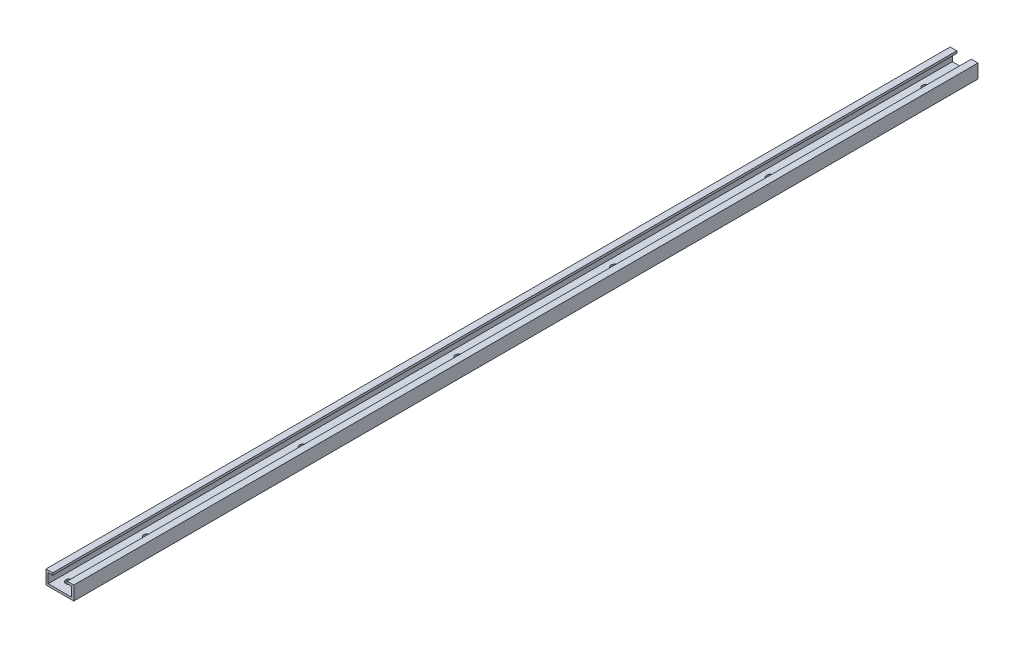
ISO-10303-21;
HEADER;
FILE_DESCRIPTION(('STEP AP214'),'2;1');
FILE_NAME('part.step','',(''),(''),'','','');
FILE_SCHEMA(('AUTOMOTIVE_DESIGN { 1 0 10303 214 1 1 1 1 }'));
ENDSEC;
DATA;
#1=APPLICATION_CONTEXT('core data for automotive mechanical design processes');
#2=APPLICATION_PROTOCOL_DEFINITION('international standard','automotive_design',2000,#1);
#3=PRODUCT_CONTEXT('',#1,'mechanical');
#4=PRODUCT('Part','Part','',(#3));
#5=PRODUCT_RELATED_PRODUCT_CATEGORY('part','',(#4));
#6=PRODUCT_DEFINITION_FORMATION('','',#4);
#7=PRODUCT_DEFINITION_CONTEXT('part definition',#1,'design');
#8=PRODUCT_DEFINITION('design','',#6,#7);
#9=PRODUCT_DEFINITION_SHAPE('','',#8);
#10=(LENGTH_UNIT() NAMED_UNIT(*) SI_UNIT(.MILLI.,.METRE.));
#11=(NAMED_UNIT(*) PLANE_ANGLE_UNIT() SI_UNIT($,.RADIAN.));
#12=(NAMED_UNIT(*) SI_UNIT($,.STERADIAN.) SOLID_ANGLE_UNIT());
#13=UNCERTAINTY_MEASURE_WITH_UNIT(LENGTH_MEASURE(1.E-05),#10,'distance_accuracy_value','');
#14=(GEOMETRIC_REPRESENTATION_CONTEXT(3) GLOBAL_UNCERTAINTY_ASSIGNED_CONTEXT((#13)) GLOBAL_UNIT_ASSIGNED_CONTEXT((#10,
#11,#12)) REPRESENTATION_CONTEXT('',''));
#15=CARTESIAN_POINT('',(0.,0.,0.));
#16=DIRECTION('',(0.,0.,1.));
#17=DIRECTION('',(1.,0.,0.));
#18=AXIS2_PLACEMENT_3D('',#15,#16,#17);
#19=CARTESIAN_POINT('',(-6.5,12.5,813.));
#20=DIRECTION('',(-1.,0.,0.));
#21=DIRECTION('',(0.,0.,1.));
#22=AXIS2_PLACEMENT_3D('',#19,#20,#21);
#23=PLANE('',#22);
#24=DIRECTION('',(0.,1.,0.));
#25=VECTOR('',#24,1.);
#26=CARTESIAN_POINT('',(-6.5,12.5,0.));
#27=LINE('',#26,#25);
#28=CARTESIAN_POINT('',(-6.5,10.5,0.));
#29=VERTEX_POINT('',#28);
#30=CARTESIAN_POINT('',(-6.5,12.5,0.));
#31=VERTEX_POINT('',#30);
#32=EDGE_CURVE('E157',#29,#31,#27,.T.);
#33=ORIENTED_EDGE('',*,*,#32,.T.);
#34=DIRECTION('',(0.,0.,-1.));
#35=VECTOR('',#34,1.);
#36=CARTESIAN_POINT('',(-6.5,12.5,813.));
#37=LINE('',#36,#35);
#38=CARTESIAN_POINT('',(-6.5,12.5,813.));
#39=VERTEX_POINT('',#38);
#40=EDGE_CURVE('E205',#39,#31,#37,.T.);
#41=ORIENTED_EDGE('',*,*,#40,.F.);
#42=DIRECTION('',(0.,1.,0.));
#43=VECTOR('',#42,1.);
#44=CARTESIAN_POINT('',(-6.5,12.5,813.));
#45=LINE('',#44,#43);
#46=CARTESIAN_POINT('',(-6.5,10.5,813.));
#47=VERTEX_POINT('',#46);
#48=EDGE_CURVE('E180',#47,#39,#45,.T.);
#49=ORIENTED_EDGE('',*,*,#48,.F.);
#50=DIRECTION('',(0.,0.,-1.));
#51=VECTOR('',#50,1.);
#52=CARTESIAN_POINT('',(-6.5,10.5,813.));
#53=LINE('',#52,#51);
#54=EDGE_CURVE('E153',#47,#29,#53,.T.);
#55=ORIENTED_EDGE('',*,*,#54,.T.);
#56=EDGE_LOOP('',(#33,#41,#49,#55));
#57=FACE_BOUND('',#56,.T.);
#58=ADVANCED_FACE('F34',(#57),#23,.F.);
#59=CARTESIAN_POINT('',(-6.5,12.5,813.));
#60=DIRECTION('',(0.,-1.,0.));
#61=DIRECTION('',(0.,0.,-1.));
#62=AXIS2_PLACEMENT_3D('',#59,#60,#61);
#63=PLANE('',#62);
#64=DIRECTION('',(-1.,0.,0.));
#65=VECTOR('',#64,1.);
#66=CARTESIAN_POINT('',(-6.5,12.5,0.));
#67=LINE('',#66,#65);
#68=CARTESIAN_POINT('',(-12.5,12.5,0.));
#69=VERTEX_POINT('',#68);
#70=EDGE_CURVE('E160',#31,#69,#67,.T.);
#71=ORIENTED_EDGE('',*,*,#70,.T.);
#72=DIRECTION('',(0.,0.,-1.));
#73=VECTOR('',#72,1.);
#74=CARTESIAN_POINT('',(-12.5,12.5,813.));
#75=LINE('',#74,#73);
#76=CARTESIAN_POINT('',(-12.5,12.5,813.));
#77=VERTEX_POINT('',#76);
#78=EDGE_CURVE('E202',#77,#69,#75,.T.);
#79=ORIENTED_EDGE('',*,*,#78,.F.);
#80=DIRECTION('',(-1.,0.,0.));
#81=VECTOR('',#80,1.);
#82=CARTESIAN_POINT('',(-6.5,12.5,813.));
#83=LINE('',#82,#81);
#84=EDGE_CURVE('E107',#39,#77,#83,.T.);
#85=ORIENTED_EDGE('',*,*,#84,.F.);
#86=ORIENTED_EDGE('',*,*,#40,.T.);
#87=EDGE_LOOP('',(#71,#79,#85,#86));
#88=FACE_BOUND('',#87,.T.);
#89=ADVANCED_FACE('F251',(#88),#63,.F.);
#90=CARTESIAN_POINT('',(-12.5,12.5,813.));
#91=DIRECTION('',(1.,0.,0.));
#92=DIRECTION('',(0.,1.,0.));
#93=AXIS2_PLACEMENT_3D('',#90,#91,#92);
#94=PLANE('',#93);
#95=DIRECTION('',(0.,-1.,0.));
#96=VECTOR('',#95,1.);
#97=CARTESIAN_POINT('',(-12.5,12.5,0.));
#98=LINE('',#97,#96);
#99=CARTESIAN_POINT('',(-12.5,0.,0.));
#100=VERTEX_POINT('',#99);
#101=EDGE_CURVE('E163',#69,#100,#98,.T.);
#102=ORIENTED_EDGE('',*,*,#101,.T.);
#103=DIRECTION('',(0.,0.,-1.));
#104=VECTOR('',#103,1.);
#105=CARTESIAN_POINT('',(-12.5,0.,813.));
#106=LINE('',#105,#104);
#107=CARTESIAN_POINT('',(-12.5,0.,813.));
#108=VERTEX_POINT('',#107);
#109=EDGE_CURVE('E199',#108,#100,#106,.T.);
#110=ORIENTED_EDGE('',*,*,#109,.F.);
#111=DIRECTION('',(0.,-1.,0.));
#112=VECTOR('',#111,1.);
#113=CARTESIAN_POINT('',(-12.5,12.5,813.));
#114=LINE('',#113,#112);
#115=EDGE_CURVE('E342',#77,#108,#114,.T.);
#116=ORIENTED_EDGE('',*,*,#115,.F.);
#117=ORIENTED_EDGE('',*,*,#78,.T.);
#118=EDGE_LOOP('',(#102,#110,#116,#117));
#119=FACE_BOUND('',#118,.T.);
#120=ADVANCED_FACE('F241',(#119),#94,.F.);
#121=CARTESIAN_POINT('',(-12.5,0.,813.));
#122=DIRECTION('',(0.,1.,0.));
#123=DIRECTION('',(-1.,0.,0.));
#124=AXIS2_PLACEMENT_3D('',#121,#122,#123);
#125=PLANE('',#124);
#126=CARTESIAN_POINT('',(-2.40627346951916,0.,731.806864394795));
#127=DIRECTION('',(0.,-1.,0.));
#128=DIRECTION('',(0.,0.,-1.));
#129=AXIS2_PLACEMENT_3D('',#126,#127,#128);
#130=CIRCLE('',#129,3.29999999999999);
#131=CARTESIAN_POINT('',(-2.40627346951916,0.,728.506864394795));
#132=VERTEX_POINT('',#131);
#133=EDGE_CURVE('E350',#132,#132,#130,.T.);
#134=ORIENTED_EDGE('',*,*,#133,.F.);
#135=EDGE_LOOP('',(#134));
#136=FACE_BOUND('',#135,.T.);
#137=CARTESIAN_POINT('',(-2.40627346951916,0.,801.806864394795));
#138=DIRECTION('',(0.,-1.,0.));
#139=DIRECTION('',(0.,0.,-1.));
#140=AXIS2_PLACEMENT_3D('',#137,#138,#139);
#141=CIRCLE('',#140,3.29999999999999);
#142=CARTESIAN_POINT('',(-2.40627346951916,0.,798.506864394795));
#143=VERTEX_POINT('',#142);
#144=EDGE_CURVE('E210',#143,#143,#141,.T.);
#145=ORIENTED_EDGE('',*,*,#144,.F.);
#146=EDGE_LOOP('',(#145));
#147=FACE_BOUND('',#146,.T.);
#148=DIRECTION('',(1.,0.,0.));
#149=VECTOR('',#148,1.);
#150=CARTESIAN_POINT('',(-12.5,0.,0.));
#151=LINE('',#150,#149);
#152=CARTESIAN_POINT('',(12.5,0.,0.));
#153=VERTEX_POINT('',#152);
#154=EDGE_CURVE('E165',#100,#153,#151,.T.);
#155=ORIENTED_EDGE('',*,*,#154,.T.);
#156=DIRECTION('',(0.,0.,-1.));
#157=VECTOR('',#156,1.);
#158=CARTESIAN_POINT('',(12.5,0.,813.));
#159=LINE('',#158,#157);
#160=CARTESIAN_POINT('',(12.5,0.,813.));
#161=VERTEX_POINT('',#160);
#162=EDGE_CURVE('E196',#161,#153,#159,.T.);
#163=ORIENTED_EDGE('',*,*,#162,.F.);
#164=DIRECTION('',(1.,0.,0.));
#165=VECTOR('',#164,1.);
#166=CARTESIAN_POINT('',(-12.5,0.,813.));
#167=LINE('',#166,#165);
#168=EDGE_CURVE('E340',#108,#161,#167,.T.);
#169=ORIENTED_EDGE('',*,*,#168,.F.);
#170=ORIENTED_EDGE('',*,*,#109,.T.);
#171=EDGE_LOOP('',(#155,#163,#169,#170));
#172=FACE_BOUND('',#171,.T.);
#173=CARTESIAN_POINT('',(-2.40627346951916,0.,591.806864394795));
#174=DIRECTION('',(0.,-1.,0.));
#175=DIRECTION('',(0.,0.,-1.));
#176=AXIS2_PLACEMENT_3D('',#173,#174,#175);
#177=CIRCLE('',#176,3.29999999999999);
#178=CARTESIAN_POINT('',(-2.40627346951916,0.,588.506864394795));
#179=VERTEX_POINT('',#178);
#180=EDGE_CURVE('E207',#179,#179,#177,.T.);
#181=ORIENTED_EDGE('',*,*,#180,.F.);
#182=EDGE_LOOP('',(#181));
#183=FACE_BOUND('',#182,.T.);
#184=CARTESIAN_POINT('',(-2.40627346951916,0.,451.806864394795));
#185=DIRECTION('',(0.,-1.,0.));
#186=DIRECTION('',(0.,0.,-1.));
#187=AXIS2_PLACEMENT_3D('',#184,#185,#186);
#188=CIRCLE('',#187,3.29999999999999);
#189=CARTESIAN_POINT('',(-2.40627346951916,0.,448.506864394795));
#190=VERTEX_POINT('',#189);
#191=EDGE_CURVE('E216',#190,#190,#188,.T.);
#192=ORIENTED_EDGE('',*,*,#191,.F.);
#193=EDGE_LOOP('',(#192));
#194=FACE_BOUND('',#193,.T.);
#195=CARTESIAN_POINT('',(-2.40627346951916,0.,311.806864394795));
#196=DIRECTION('',(0.,-1.,0.));
#197=DIRECTION('',(0.,0.,-1.));
#198=AXIS2_PLACEMENT_3D('',#195,#196,#197);
#199=CIRCLE('',#198,3.29999999999999);
#200=CARTESIAN_POINT('',(-2.40627346951916,0.,308.506864394795));
#201=VERTEX_POINT('',#200);
#202=EDGE_CURVE('E222',#201,#201,#199,.T.);
#203=ORIENTED_EDGE('',*,*,#202,.F.);
#204=EDGE_LOOP('',(#203));
#205=FACE_BOUND('',#204,.T.);
#206=CARTESIAN_POINT('',(-2.40627346951916,0.,171.806864394795));
#207=DIRECTION('',(0.,-1.,0.));
#208=DIRECTION('',(0.,0.,-1.));
#209=AXIS2_PLACEMENT_3D('',#206,#207,#208);
#210=CIRCLE('',#209,3.29999999999999);
#211=CARTESIAN_POINT('',(-2.40627346951916,0.,168.506864394795));
#212=VERTEX_POINT('',#211);
#213=EDGE_CURVE('E228',#212,#212,#210,.T.);
#214=ORIENTED_EDGE('',*,*,#213,.F.);
#215=EDGE_LOOP('',(#214));
#216=FACE_BOUND('',#215,.T.);
#217=CARTESIAN_POINT('',(-2.40627346951916,0.,31.8068643947949));
#218=DIRECTION('',(0.,-1.,0.));
#219=DIRECTION('',(0.,0.,-1.));
#220=AXIS2_PLACEMENT_3D('',#217,#218,#219);
#221=CIRCLE('',#220,3.29999999999999);
#222=CARTESIAN_POINT('',(-2.40627346951916,0.,28.5068643947949));
#223=VERTEX_POINT('',#222);
#224=EDGE_CURVE('E43',#223,#223,#221,.T.);
#225=ORIENTED_EDGE('',*,*,#224,.F.);
#226=EDGE_LOOP('',(#225));
#227=FACE_BOUND('',#226,.T.);
#228=ADVANCED_FACE('F238',(#136,#147,#172,#183,#194,#205,#216,#227),#125,.F.);
#229=CARTESIAN_POINT('',(12.5,0.,813.));
#230=DIRECTION('',(-1.,0.,0.));
#231=DIRECTION('',(0.,-1.,0.));
#232=AXIS2_PLACEMENT_3D('',#229,#230,#231);
#233=PLANE('',#232);
#234=DIRECTION('',(0.,1.,0.));
#235=VECTOR('',#234,1.);
#236=CARTESIAN_POINT('',(12.5,0.,0.));
#237=LINE('',#236,#235);
#238=CARTESIAN_POINT('',(12.5,12.5,0.));
#239=VERTEX_POINT('',#238);
#240=EDGE_CURVE('E167',#153,#239,#237,.T.);
#241=ORIENTED_EDGE('',*,*,#240,.T.);
#242=DIRECTION('',(0.,0.,-1.));
#243=VECTOR('',#242,1.);
#244=CARTESIAN_POINT('',(12.5,12.5,813.));
#245=LINE('',#244,#243);
#246=CARTESIAN_POINT('',(12.5,12.5,813.));
#247=VERTEX_POINT('',#246);
#248=EDGE_CURVE('E193',#247,#239,#245,.T.);
#249=ORIENTED_EDGE('',*,*,#248,.F.);
#250=DIRECTION('',(0.,1.,0.));
#251=VECTOR('',#250,1.);
#252=CARTESIAN_POINT('',(12.5,0.,813.));
#253=LINE('',#252,#251);
#254=EDGE_CURVE('E338',#161,#247,#253,.T.);
#255=ORIENTED_EDGE('',*,*,#254,.F.);
#256=ORIENTED_EDGE('',*,*,#162,.T.);
#257=EDGE_LOOP('',(#241,#249,#255,#256));
#258=FACE_BOUND('',#257,.T.);
#259=ADVANCED_FACE('F240',(#258),#233,.F.);
#260=CARTESIAN_POINT('',(12.5,12.5,813.));
#261=DIRECTION('',(0.,-1.,0.));
#262=DIRECTION('',(1.,0.,0.));
#263=AXIS2_PLACEMENT_3D('',#260,#261,#262);
#264=PLANE('',#263);
#265=DIRECTION('',(-1.,0.,0.));
#266=VECTOR('',#265,1.);
#267=CARTESIAN_POINT('',(12.5,12.5,0.));
#268=LINE('',#267,#266);
#269=CARTESIAN_POINT('',(6.5,12.5,0.));
#270=VERTEX_POINT('',#269);
#271=EDGE_CURVE('E169',#239,#270,#268,.T.);
#272=ORIENTED_EDGE('',*,*,#271,.T.);
#273=DIRECTION('',(0.,0.,-1.));
#274=VECTOR('',#273,1.);
#275=CARTESIAN_POINT('',(6.5,12.5,813.));
#276=LINE('',#275,#274);
#277=CARTESIAN_POINT('',(6.5,12.5,813.));
#278=VERTEX_POINT('',#277);
#279=EDGE_CURVE('E190',#278,#270,#276,.T.);
#280=ORIENTED_EDGE('',*,*,#279,.F.);
#281=DIRECTION('',(-1.,0.,0.));
#282=VECTOR('',#281,1.);
#283=CARTESIAN_POINT('',(12.5,12.5,813.));
#284=LINE('',#283,#282);
#285=EDGE_CURVE('E336',#247,#278,#284,.T.);
#286=ORIENTED_EDGE('',*,*,#285,.F.);
#287=ORIENTED_EDGE('',*,*,#248,.T.);
#288=EDGE_LOOP('',(#272,#280,#286,#287));
#289=FACE_BOUND('',#288,.T.);
#290=ADVANCED_FACE('F248',(#289),#264,.F.);
#291=CARTESIAN_POINT('',(6.5,12.5,813.));
#292=DIRECTION('',(1.,0.,0.));
#293=DIRECTION('',(0.,0.,-1.));
#294=AXIS2_PLACEMENT_3D('',#291,#292,#293);
#295=PLANE('',#294);
#296=DIRECTION('',(0.,-1.,0.));
#297=VECTOR('',#296,1.);
#298=CARTESIAN_POINT('',(6.5,12.5,0.));
#299=LINE('',#298,#297);
#300=CARTESIAN_POINT('',(6.5,10.5,0.));
#301=VERTEX_POINT('',#300);
#302=EDGE_CURVE('E171',#270,#301,#299,.T.);
#303=ORIENTED_EDGE('',*,*,#302,.T.);
#304=DIRECTION('',(0.,0.,-1.));
#305=VECTOR('',#304,1.);
#306=CARTESIAN_POINT('',(6.5,10.5,813.));
#307=LINE('',#306,#305);
#308=CARTESIAN_POINT('',(6.5,10.5,813.));
#309=VERTEX_POINT('',#308);
#310=EDGE_CURVE('E187',#309,#301,#307,.T.);
#311=ORIENTED_EDGE('',*,*,#310,.F.);
#312=DIRECTION('',(0.,-1.,0.));
#313=VECTOR('',#312,1.);
#314=CARTESIAN_POINT('',(6.5,12.5,813.));
#315=LINE('',#314,#313);
#316=EDGE_CURVE('E325',#278,#309,#315,.T.);
#317=ORIENTED_EDGE('',*,*,#316,.F.);
#318=ORIENTED_EDGE('',*,*,#279,.T.);
#319=EDGE_LOOP('',(#303,#311,#317,#318));
#320=FACE_BOUND('',#319,.T.);
#321=ADVANCED_FACE('F307',(#320),#295,.F.);
#322=CARTESIAN_POINT('',(10.5,10.5,813.));
#323=DIRECTION('',(0.,1.,0.));
#324=DIRECTION('',(0.,0.,1.));
#325=AXIS2_PLACEMENT_3D('',#322,#323,#324);
#326=PLANE('',#325);
#327=DIRECTION('',(1.,0.,0.));
#328=VECTOR('',#327,1.);
#329=CARTESIAN_POINT('',(10.5,10.5,0.));
#330=LINE('',#329,#328);
#331=CARTESIAN_POINT('',(10.5,10.5,0.));
#332=VERTEX_POINT('',#331);
#333=EDGE_CURVE('E173',#301,#332,#330,.T.);
#334=ORIENTED_EDGE('',*,*,#333,.T.);
#335=DIRECTION('',(0.,0.,-1.));
#336=VECTOR('',#335,1.);
#337=CARTESIAN_POINT('',(10.5,10.5,813.));
#338=LINE('',#337,#336);
#339=CARTESIAN_POINT('',(10.5,10.5,813.));
#340=VERTEX_POINT('',#339);
#341=EDGE_CURVE('E184',#340,#332,#338,.T.);
#342=ORIENTED_EDGE('',*,*,#341,.F.);
#343=DIRECTION('',(1.,0.,0.));
#344=VECTOR('',#343,1.);
#345=CARTESIAN_POINT('',(10.5,10.5,813.));
#346=LINE('',#345,#344);
#347=EDGE_CURVE('E332',#309,#340,#346,.T.);
#348=ORIENTED_EDGE('',*,*,#347,.F.);
#349=ORIENTED_EDGE('',*,*,#310,.T.);
#350=EDGE_LOOP('',(#334,#342,#348,#349));
#351=FACE_BOUND('',#350,.T.);
#352=ADVANCED_FACE('F298',(#351),#326,.F.);
#353=CARTESIAN_POINT('',(10.5,2.,813.));
#354=DIRECTION('',(1.,0.,0.));
#355=DIRECTION('',(0.,0.,-1.));
#356=AXIS2_PLACEMENT_3D('',#353,#354,#355);
#357=PLANE('',#356);
#358=DIRECTION('',(0.,-1.,0.));
#359=VECTOR('',#358,1.);
#360=CARTESIAN_POINT('',(10.5,2.,0.));
#361=LINE('',#360,#359);
#362=CARTESIAN_POINT('',(10.5,2.,0.));
#363=VERTEX_POINT('',#362);
#364=EDGE_CURVE('E175',#332,#363,#361,.T.);
#365=ORIENTED_EDGE('',*,*,#364,.T.);
#366=DIRECTION('',(0.,0.,-1.));
#367=VECTOR('',#366,1.);
#368=CARTESIAN_POINT('',(10.5,2.,813.));
#369=LINE('',#368,#367);
#370=CARTESIAN_POINT('',(10.5,2.,813.));
#371=VERTEX_POINT('',#370);
#372=EDGE_CURVE('E148',#371,#363,#369,.T.);
#373=ORIENTED_EDGE('',*,*,#372,.F.);
#374=DIRECTION('',(0.,-1.,0.));
#375=VECTOR('',#374,1.);
#376=CARTESIAN_POINT('',(10.5,2.,813.));
#377=LINE('',#376,#375);
#378=EDGE_CURVE('E138',#340,#371,#377,.T.);
#379=ORIENTED_EDGE('',*,*,#378,.F.);
#380=ORIENTED_EDGE('',*,*,#341,.T.);
#381=EDGE_LOOP('',(#365,#373,#379,#380));
#382=FACE_BOUND('',#381,.T.);
#383=ADVANCED_FACE('F288',(#382),#357,.F.);
#384=CARTESIAN_POINT('',(-10.5,2.,813.));
#385=DIRECTION('',(0.,-1.,0.));
#386=DIRECTION('',(0.,0.,-1.));
#387=AXIS2_PLACEMENT_3D('',#384,#385,#386);
#388=PLANE('',#387);
#389=CARTESIAN_POINT('',(-2.40627346951916,2.,731.806864394795));
#390=DIRECTION('',(0.,-1.,0.));
#391=DIRECTION('',(0.,0.,-1.));
#392=AXIS2_PLACEMENT_3D('',#389,#390,#391);
#393=CIRCLE('',#392,3.29999999999999);
#394=CARTESIAN_POINT('',(-2.40627346951916,2.,728.506864394795));
#395=VERTEX_POINT('',#394);
#396=EDGE_CURVE('E348',#395,#395,#393,.T.);
#397=ORIENTED_EDGE('',*,*,#396,.T.);
#398=EDGE_LOOP('',(#397));
#399=FACE_BOUND('',#398,.T.);
#400=CARTESIAN_POINT('',(-2.40627346951916,2.,801.806864394795));
#401=DIRECTION('',(0.,-1.,0.));
#402=DIRECTION('',(0.,0.,-1.));
#403=AXIS2_PLACEMENT_3D('',#400,#401,#402);
#404=CIRCLE('',#403,3.29999999999999);
#405=CARTESIAN_POINT('',(-2.40627346951916,2.,798.506864394795));
#406=VERTEX_POINT('',#405);
#407=EDGE_CURVE('E161',#406,#406,#404,.T.);
#408=ORIENTED_EDGE('',*,*,#407,.T.);
#409=EDGE_LOOP('',(#408));
#410=FACE_BOUND('',#409,.T.);
#411=DIRECTION('',(-1.,0.,0.));
#412=VECTOR('',#411,1.);
#413=CARTESIAN_POINT('',(-10.5,2.,0.));
#414=LINE('',#413,#412);
#415=CARTESIAN_POINT('',(-10.5,2.,0.));
#416=VERTEX_POINT('',#415);
#417=EDGE_CURVE('E147',#363,#416,#414,.T.);
#418=ORIENTED_EDGE('',*,*,#417,.T.);
#419=DIRECTION('',(0.,0.,-1.));
#420=VECTOR('',#419,1.);
#421=CARTESIAN_POINT('',(-10.5,2.,813.));
#422=LINE('',#421,#420);
#423=CARTESIAN_POINT('',(-10.5,2.,813.));
#424=VERTEX_POINT('',#423);
#425=EDGE_CURVE('E143',#424,#416,#422,.T.);
#426=ORIENTED_EDGE('',*,*,#425,.F.);
#427=DIRECTION('',(-1.,0.,0.));
#428=VECTOR('',#427,1.);
#429=CARTESIAN_POINT('',(-10.5,2.,813.));
#430=LINE('',#429,#428);
#431=EDGE_CURVE('E132',#371,#424,#430,.T.);
#432=ORIENTED_EDGE('',*,*,#431,.F.);
#433=ORIENTED_EDGE('',*,*,#372,.T.);
#434=EDGE_LOOP('',(#418,#426,#432,#433));
#435=FACE_BOUND('',#434,.T.);
#436=CARTESIAN_POINT('',(-2.40627346951916,2.,591.806864394795));
#437=DIRECTION('',(0.,-1.,0.));
#438=DIRECTION('',(0.,0.,-1.));
#439=AXIS2_PLACEMENT_3D('',#436,#437,#438);
#440=CIRCLE('',#439,3.29999999999999);
#441=CARTESIAN_POINT('',(-2.40627346951916,2.,588.506864394795));
#442=VERTEX_POINT('',#441);
#443=EDGE_CURVE('E213',#442,#442,#440,.T.);
#444=ORIENTED_EDGE('',*,*,#443,.T.);
#445=EDGE_LOOP('',(#444));
#446=FACE_BOUND('',#445,.T.);
#447=CARTESIAN_POINT('',(-2.40627346951916,2.,451.806864394795));
#448=DIRECTION('',(0.,-1.,0.));
#449=DIRECTION('',(0.,0.,-1.));
#450=AXIS2_PLACEMENT_3D('',#447,#448,#449);
#451=CIRCLE('',#450,3.29999999999999);
#452=CARTESIAN_POINT('',(-2.40627346951916,2.,448.506864394795));
#453=VERTEX_POINT('',#452);
#454=EDGE_CURVE('E219',#453,#453,#451,.T.);
#455=ORIENTED_EDGE('',*,*,#454,.T.);
#456=EDGE_LOOP('',(#455));
#457=FACE_BOUND('',#456,.T.);
#458=CARTESIAN_POINT('',(-2.40627346951916,2.,311.806864394795));
#459=DIRECTION('',(0.,-1.,0.));
#460=DIRECTION('',(0.,0.,-1.));
#461=AXIS2_PLACEMENT_3D('',#458,#459,#460);
#462=CIRCLE('',#461,3.29999999999999);
#463=CARTESIAN_POINT('',(-2.40627346951916,2.,308.506864394795));
#464=VERTEX_POINT('',#463);
#465=EDGE_CURVE('E225',#464,#464,#462,.T.);
#466=ORIENTED_EDGE('',*,*,#465,.T.);
#467=EDGE_LOOP('',(#466));
#468=FACE_BOUND('',#467,.T.);
#469=CARTESIAN_POINT('',(-2.40627346951916,2.,171.806864394795));
#470=DIRECTION('',(0.,-1.,0.));
#471=DIRECTION('',(0.,0.,-1.));
#472=AXIS2_PLACEMENT_3D('',#469,#470,#471);
#473=CIRCLE('',#472,3.29999999999999);
#474=CARTESIAN_POINT('',(-2.40627346951916,2.,168.506864394795));
#475=VERTEX_POINT('',#474);
#476=EDGE_CURVE('E231',#475,#475,#473,.T.);
#477=ORIENTED_EDGE('',*,*,#476,.T.);
#478=EDGE_LOOP('',(#477));
#479=FACE_BOUND('',#478,.T.);
#480=CARTESIAN_POINT('',(-2.40627346951916,2.,31.8068643947949));
#481=DIRECTION('',(0.,-1.,0.));
#482=DIRECTION('',(0.,0.,-1.));
#483=AXIS2_PLACEMENT_3D('',#480,#481,#482);
#484=CIRCLE('',#483,3.29999999999999);
#485=CARTESIAN_POINT('',(-2.40627346951916,2.,28.5068643947949));
#486=VERTEX_POINT('',#485);
#487=EDGE_CURVE('E11',#486,#486,#484,.T.);
#488=ORIENTED_EDGE('',*,*,#487,.T.);
#489=EDGE_LOOP('',(#488));
#490=FACE_BOUND('',#489,.T.);
#491=ADVANCED_FACE('F144',(#399,#410,#435,#446,#457,#468,#479,#490),#388,.F.);
#492=CARTESIAN_POINT('',(-10.5,10.5,813.));
#493=DIRECTION('',(-1.,0.,0.));
#494=DIRECTION('',(0.,-1.,0.));
#495=AXIS2_PLACEMENT_3D('',#492,#493,#494);
#496=PLANE('',#495);
#497=DIRECTION('',(0.,1.,0.));
#498=VECTOR('',#497,1.);
#499=CARTESIAN_POINT('',(-10.5,10.5,0.));
#500=LINE('',#499,#498);
#501=CARTESIAN_POINT('',(-10.5,10.5,0.));
#502=VERTEX_POINT('',#501);
#503=EDGE_CURVE('E92',#416,#502,#500,.T.);
#504=ORIENTED_EDGE('',*,*,#503,.T.);
#505=DIRECTION('',(0.,0.,-1.));
#506=VECTOR('',#505,1.);
#507=CARTESIAN_POINT('',(-10.5,10.5,813.));
#508=LINE('',#507,#506);
#509=CARTESIAN_POINT('',(-10.5,10.5,813.));
#510=VERTEX_POINT('',#509);
#511=EDGE_CURVE('E149',#510,#502,#508,.T.);
#512=ORIENTED_EDGE('',*,*,#511,.F.);
#513=DIRECTION('',(0.,1.,0.));
#514=VECTOR('',#513,1.);
#515=CARTESIAN_POINT('',(-10.5,10.5,813.));
#516=LINE('',#515,#514);
#517=EDGE_CURVE('E136',#424,#510,#516,.T.);
#518=ORIENTED_EDGE('',*,*,#517,.F.);
#519=ORIENTED_EDGE('',*,*,#425,.T.);
#520=EDGE_LOOP('',(#504,#512,#518,#519));
#521=FACE_BOUND('',#520,.T.);
#522=ADVANCED_FACE('F151',(#521),#496,.F.);
#523=CARTESIAN_POINT('',(-6.5,10.5,813.));
#524=DIRECTION('',(0.,1.,0.));
#525=DIRECTION('',(0.,0.,1.));
#526=AXIS2_PLACEMENT_3D('',#523,#524,#525);
#527=PLANE('',#526);
#528=DIRECTION('',(1.,0.,0.));
#529=VECTOR('',#528,1.);
#530=CARTESIAN_POINT('',(-6.5,10.5,0.));
#531=LINE('',#530,#529);
#532=EDGE_CURVE('E98',#502,#29,#531,.T.);
#533=ORIENTED_EDGE('',*,*,#532,.T.);
#534=ORIENTED_EDGE('',*,*,#54,.F.);
#535=DIRECTION('',(1.,0.,0.));
#536=VECTOR('',#535,1.);
#537=CARTESIAN_POINT('',(-6.5,10.5,813.));
#538=LINE('',#537,#536);
#539=EDGE_CURVE('E51',#510,#47,#538,.T.);
#540=ORIENTED_EDGE('',*,*,#539,.F.);
#541=ORIENTED_EDGE('',*,*,#511,.T.);
#542=EDGE_LOOP('',(#533,#534,#540,#541));
#543=FACE_BOUND('',#542,.T.);
#544=ADVANCED_FACE('F296',(#543),#527,.F.);
#545=CARTESIAN_POINT('',(0.,0.,813.));
#546=DIRECTION('',(0.,0.,-1.));
#547=DIRECTION('',(-1.,0.,0.));
#548=AXIS2_PLACEMENT_3D('',#545,#546,#547);
#549=PLANE('',#548);
#550=ORIENTED_EDGE('',*,*,#48,.T.);
#551=ORIENTED_EDGE('',*,*,#84,.T.);
#552=ORIENTED_EDGE('',*,*,#115,.T.);
#553=ORIENTED_EDGE('',*,*,#168,.T.);
#554=ORIENTED_EDGE('',*,*,#254,.T.);
#555=ORIENTED_EDGE('',*,*,#285,.T.);
#556=ORIENTED_EDGE('',*,*,#316,.T.);
#557=ORIENTED_EDGE('',*,*,#347,.T.);
#558=ORIENTED_EDGE('',*,*,#378,.T.);
#559=ORIENTED_EDGE('',*,*,#431,.T.);
#560=ORIENTED_EDGE('',*,*,#517,.T.);
#561=ORIENTED_EDGE('',*,*,#539,.T.);
#562=EDGE_LOOP('',(#550,#551,#552,#553,#554,#555,#556,#557,#558,#559,#560,#561));
#563=FACE_BOUND('',#562,.T.);
#564=ADVANCED_FACE('F134',(#563),#549,.F.);
#565=CARTESIAN_POINT('',(0.,0.,0.));
#566=DIRECTION('',(0.,0.,-1.));
#567=DIRECTION('',(-1.,0.,0.));
#568=AXIS2_PLACEMENT_3D('',#565,#566,#567);
#569=PLANE('',#568);
#570=ORIENTED_EDGE('',*,*,#32,.F.);
#571=ORIENTED_EDGE('',*,*,#532,.F.);
#572=ORIENTED_EDGE('',*,*,#503,.F.);
#573=ORIENTED_EDGE('',*,*,#417,.F.);
#574=ORIENTED_EDGE('',*,*,#364,.F.);
#575=ORIENTED_EDGE('',*,*,#333,.F.);
#576=ORIENTED_EDGE('',*,*,#302,.F.);
#577=ORIENTED_EDGE('',*,*,#271,.F.);
#578=ORIENTED_EDGE('',*,*,#240,.F.);
#579=ORIENTED_EDGE('',*,*,#154,.F.);
#580=ORIENTED_EDGE('',*,*,#101,.F.);
#581=ORIENTED_EDGE('',*,*,#70,.F.);
#582=EDGE_LOOP('',(#570,#571,#572,#573,#574,#575,#576,#577,#578,#579,#580,#581));
#583=FACE_BOUND('',#582,.T.);
#584=ADVANCED_FACE('F328',(#583),#569,.T.);
#585=CARTESIAN_POINT('',(-2.40627346951916,0.,801.806864394795));
#586=DIRECTION('',(0.,-1.,0.));
#587=DIRECTION('',(0.,0.,-1.));
#588=AXIS2_PLACEMENT_3D('',#585,#586,#587);
#589=CYLINDRICAL_SURFACE('',#588,3.29999999999999);
#590=ORIENTED_EDGE('',*,*,#144,.T.);
#591=EDGE_LOOP('',(#590));
#592=FACE_BOUND('',#591,.T.);
#593=ORIENTED_EDGE('',*,*,#407,.F.);
#594=EDGE_LOOP('',(#593));
#595=FACE_BOUND('',#594,.T.);
#596=ADVANCED_FACE('F355',(#592,#595),#589,.F.);
#597=CARTESIAN_POINT('',(-2.40627346951916,0.,731.806864394795));
#598=DIRECTION('',(0.,-1.,0.));
#599=DIRECTION('',(0.,0.,-1.));
#600=AXIS2_PLACEMENT_3D('',#597,#598,#599);
#601=CYLINDRICAL_SURFACE('',#600,3.29999999999999);
#602=ORIENTED_EDGE('',*,*,#133,.T.);
#603=EDGE_LOOP('',(#602));
#604=FACE_BOUND('',#603,.T.);
#605=ORIENTED_EDGE('',*,*,#396,.F.);
#606=EDGE_LOOP('',(#605));
#607=FACE_BOUND('',#606,.T.);
#608=ADVANCED_FACE('F268',(#604,#607),#601,.F.);
#609=CARTESIAN_POINT('',(-2.40627346951916,0.,591.806864394795));
#610=DIRECTION('',(0.,-1.,0.));
#611=DIRECTION('',(0.,0.,-1.));
#612=AXIS2_PLACEMENT_3D('',#609,#610,#611);
#613=CYLINDRICAL_SURFACE('',#612,3.29999999999999);
#614=ORIENTED_EDGE('',*,*,#180,.T.);
#615=EDGE_LOOP('',(#614));
#616=FACE_BOUND('',#615,.T.);
#617=ORIENTED_EDGE('',*,*,#443,.F.);
#618=EDGE_LOOP('',(#617));
#619=FACE_BOUND('',#618,.T.);
#620=ADVANCED_FACE('F264',(#616,#619),#613,.F.);
#621=CARTESIAN_POINT('',(-2.40627346951916,0.,451.806864394795));
#622=DIRECTION('',(0.,-1.,0.));
#623=DIRECTION('',(0.,0.,-1.));
#624=AXIS2_PLACEMENT_3D('',#621,#622,#623);
#625=CYLINDRICAL_SURFACE('',#624,3.29999999999999);
#626=ORIENTED_EDGE('',*,*,#191,.T.);
#627=EDGE_LOOP('',(#626));
#628=FACE_BOUND('',#627,.T.);
#629=ORIENTED_EDGE('',*,*,#454,.F.);
#630=EDGE_LOOP('',(#629));
#631=FACE_BOUND('',#630,.T.);
#632=ADVANCED_FACE('F267',(#628,#631),#625,.F.);
#633=CARTESIAN_POINT('',(-2.40627346951916,0.,311.806864394795));
#634=DIRECTION('',(0.,-1.,0.));
#635=DIRECTION('',(0.,0.,-1.));
#636=AXIS2_PLACEMENT_3D('',#633,#634,#635);
#637=CYLINDRICAL_SURFACE('',#636,3.29999999999999);
#638=ORIENTED_EDGE('',*,*,#202,.T.);
#639=EDGE_LOOP('',(#638));
#640=FACE_BOUND('',#639,.T.);
#641=ORIENTED_EDGE('',*,*,#465,.F.);
#642=EDGE_LOOP('',(#641));
#643=FACE_BOUND('',#642,.T.);
#644=ADVANCED_FACE('F272',(#640,#643),#637,.F.);
#645=CARTESIAN_POINT('',(-2.40627346951916,0.,171.806864394795));
#646=DIRECTION('',(0.,-1.,0.));
#647=DIRECTION('',(0.,0.,-1.));
#648=AXIS2_PLACEMENT_3D('',#645,#646,#647);
#649=CYLINDRICAL_SURFACE('',#648,3.29999999999999);
#650=ORIENTED_EDGE('',*,*,#213,.T.);
#651=EDGE_LOOP('',(#650));
#652=FACE_BOUND('',#651,.T.);
#653=ORIENTED_EDGE('',*,*,#476,.F.);
#654=EDGE_LOOP('',(#653));
#655=FACE_BOUND('',#654,.T.);
#656=ADVANCED_FACE('F275',(#652,#655),#649,.F.);
#657=CARTESIAN_POINT('',(-2.40627346951916,0.,31.8068643947949));
#658=DIRECTION('',(0.,-1.,0.));
#659=DIRECTION('',(0.,0.,-1.));
#660=AXIS2_PLACEMENT_3D('',#657,#658,#659);
#661=CYLINDRICAL_SURFACE('',#660,3.29999999999999);
#662=ORIENTED_EDGE('',*,*,#224,.T.);
#663=EDGE_LOOP('',(#662));
#664=FACE_BOUND('',#663,.T.);
#665=ORIENTED_EDGE('',*,*,#487,.F.);
#666=EDGE_LOOP('',(#665));
#667=FACE_BOUND('',#666,.T.);
#668=ADVANCED_FACE('F36',(#664,#667),#661,.F.);
#669=CLOSED_SHELL('',(#58,#89,#120,#228,#259,#290,#321,#352,#383,#491,#522,#544,#564,#584,#596,
#608,#620,#632,#644,#656,#668));
#670=MANIFOLD_SOLID_BREP('B2',#669);
#671=ADVANCED_BREP_SHAPE_REPRESENTATION('',(#18,#670),#14);
#672=SHAPE_DEFINITION_REPRESENTATION(#9,#671);
ENDSEC;
END-ISO-10303-21;
